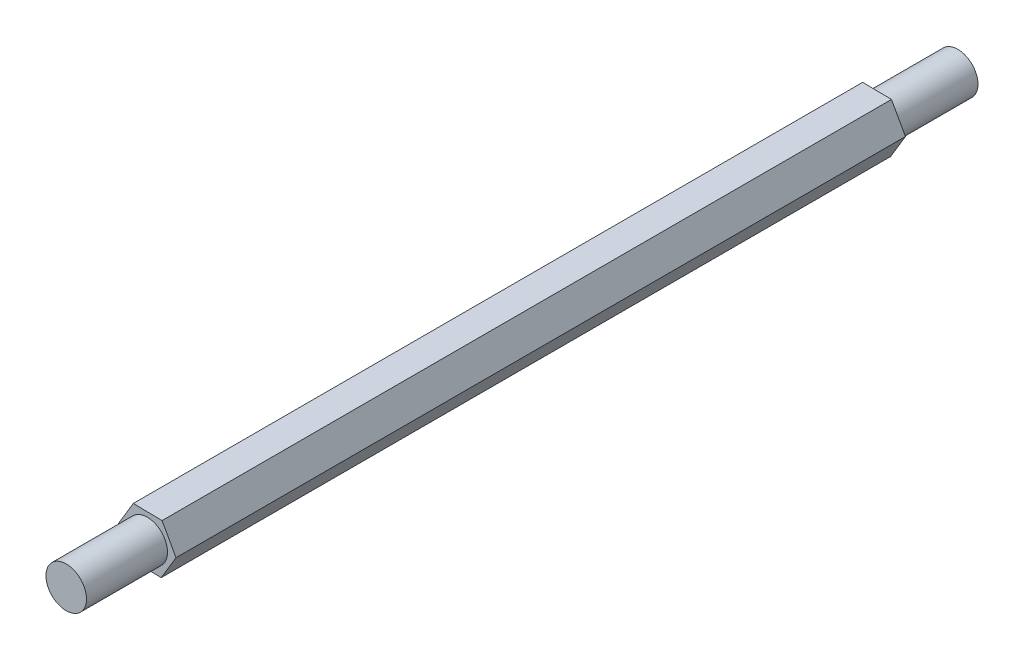
ISO-10303-21;
HEADER;
FILE_DESCRIPTION(('STEP AP214'),'2;1');
FILE_NAME('part.step','',(''),(''),'','','');
FILE_SCHEMA(('AUTOMOTIVE_DESIGN { 1 0 10303 214 1 1 1 1 }'));
ENDSEC;
DATA;
#1=APPLICATION_CONTEXT('core data for automotive mechanical design processes');
#2=APPLICATION_PROTOCOL_DEFINITION('international standard','automotive_design',2000,#1);
#3=PRODUCT_CONTEXT('',#1,'mechanical');
#4=PRODUCT('Part','Part','',(#3));
#5=PRODUCT_RELATED_PRODUCT_CATEGORY('part','',(#4));
#6=PRODUCT_DEFINITION_FORMATION('','',#4);
#7=PRODUCT_DEFINITION_CONTEXT('part definition',#1,'design');
#8=PRODUCT_DEFINITION('design','',#6,#7);
#9=PRODUCT_DEFINITION_SHAPE('','',#8);
#10=(LENGTH_UNIT() NAMED_UNIT(*) SI_UNIT(.MILLI.,.METRE.));
#11=(NAMED_UNIT(*) PLANE_ANGLE_UNIT() SI_UNIT($,.RADIAN.));
#12=(NAMED_UNIT(*) SI_UNIT($,.STERADIAN.) SOLID_ANGLE_UNIT());
#13=UNCERTAINTY_MEASURE_WITH_UNIT(LENGTH_MEASURE(1.E-05),#10,'distance_accuracy_value','');
#14=(GEOMETRIC_REPRESENTATION_CONTEXT(3) GLOBAL_UNCERTAINTY_ASSIGNED_CONTEXT((#13)) GLOBAL_UNIT_ASSIGNED_CONTEXT((#10,
#11,#12)) REPRESENTATION_CONTEXT('',''));
#15=CARTESIAN_POINT('',(0.,0.,0.));
#16=DIRECTION('',(0.,0.,1.));
#17=DIRECTION('',(1.,0.,0.));
#18=AXIS2_PLACEMENT_3D('',#15,#16,#17);
#19=CARTESIAN_POINT('',(0.,0.,10.));
#20=DIRECTION('',(0.,0.,-1.));
#21=DIRECTION('',(-1.,0.,0.));
#22=AXIS2_PLACEMENT_3D('',#19,#20,#21);
#23=CYLINDRICAL_SURFACE('',#22,2.5);
#24=CARTESIAN_POINT('',(0.,0.,10.));
#25=DIRECTION('',(0.,0.,1.));
#26=DIRECTION('',(1.,0.,0.));
#27=AXIS2_PLACEMENT_3D('',#24,#25,#26);
#28=CIRCLE('',#27,2.5);
#29=CARTESIAN_POINT('',(2.5,0.,10.));
#30=VERTEX_POINT('',#29);
#31=EDGE_CURVE('E55',#30,#30,#28,.T.);
#32=ORIENTED_EDGE('',*,*,#31,.F.);
#33=EDGE_LOOP('',(#32));
#34=FACE_BOUND('',#33,.T.);
#35=CARTESIAN_POINT('',(0.,0.,0.));
#36=DIRECTION('',(0.,0.,1.));
#37=DIRECTION('',(1.,0.,0.));
#38=AXIS2_PLACEMENT_3D('',#35,#36,#37);
#39=CIRCLE('',#38,2.5);
#40=CARTESIAN_POINT('',(2.5,0.,0.));
#41=VERTEX_POINT('',#40);
#42=EDGE_CURVE('E48',#41,#41,#39,.T.);
#43=ORIENTED_EDGE('',*,*,#42,.T.);
#44=EDGE_LOOP('',(#43));
#45=FACE_BOUND('',#44,.T.);
#46=ADVANCED_FACE('F45',(#34,#45),#23,.T.);
#47=CARTESIAN_POINT('',(0.,0.,0.));
#48=DIRECTION('',(0.,0.,1.));
#49=DIRECTION('',(1.,0.,0.));
#50=AXIS2_PLACEMENT_3D('',#47,#48,#49);
#51=PLANE('',#50);
#52=ORIENTED_EDGE('',*,*,#42,.F.);
#53=EDGE_LOOP('',(#52));
#54=FACE_BOUND('',#53,.T.);
#55=ADVANCED_FACE('F176',(#54),#51,.F.);
#56=CARTESIAN_POINT('',(1.72530609152991,-3.10214690047344,100.));
#57=DIRECTION('',(-0.857897146198672,0.513821453954751,0.));
#58=DIRECTION('',(-0.513821453954751,-0.857897146198672,0.));
#59=AXIS2_PLACEMENT_3D('',#56,#57,#58);
#60=PLANE('',#59);
#61=DIRECTION('',(0.513821453954751,0.857897146198672,0.));
#62=VECTOR('',#61,1.);
#63=CARTESIAN_POINT('',(1.72530609152991,-3.10214690047344,10.));
#64=LINE('',#63,#62);
#65=CARTESIAN_POINT('',(1.72530609152991,-3.10214690047344,10.));
#66=VERTEX_POINT('',#65);
#67=CARTESIAN_POINT('',(3.54919106784611,-0.0569145456677691,10.));
#68=VERTEX_POINT('',#67);
#69=EDGE_CURVE('E137',#66,#68,#64,.T.);
#70=ORIENTED_EDGE('',*,*,#69,.T.);
#71=DIRECTION('',(0.,0.,-1.));
#72=VECTOR('',#71,1.);
#73=CARTESIAN_POINT('',(3.54919106784611,-0.0569145456677691,100.));
#74=LINE('',#73,#72);
#75=CARTESIAN_POINT('',(3.54919106784611,-0.0569145456677691,100.));
#76=VERTEX_POINT('',#75);
#77=EDGE_CURVE('E165',#76,#68,#74,.T.);
#78=ORIENTED_EDGE('',*,*,#77,.F.);
#79=DIRECTION('',(0.513821453954751,0.857897146198672,0.));
#80=VECTOR('',#79,1.);
#81=CARTESIAN_POINT('',(1.72530609152991,-3.10214690047344,100.));
#82=LINE('',#81,#80);
#83=CARTESIAN_POINT('',(1.72530609152991,-3.10214690047344,100.));
#84=VERTEX_POINT('',#83);
#85=EDGE_CURVE('E154',#84,#76,#82,.T.);
#86=ORIENTED_EDGE('',*,*,#85,.F.);
#87=DIRECTION('',(0.,0.,-1.));
#88=VECTOR('',#87,1.);
#89=CARTESIAN_POINT('',(1.72530609152991,-3.10214690047344,100.));
#90=LINE('',#89,#88);
#91=EDGE_CURVE('E133',#84,#66,#90,.T.);
#92=ORIENTED_EDGE('',*,*,#91,.T.);
#93=EDGE_LOOP('',(#70,#78,#86,#92));
#94=FACE_BOUND('',#93,.T.);
#95=ADVANCED_FACE('F178',(#94),#60,.F.);
#96=CARTESIAN_POINT('',(3.54919106784611,-0.0569145456677691,100.));
#97=DIRECTION('',(-0.873931005233606,-0.486049995464848,0.));
#98=DIRECTION('',(0.486049995464848,-0.873931005233606,0.));
#99=AXIS2_PLACEMENT_3D('',#96,#97,#98);
#100=PLANE('',#99);
#101=DIRECTION('',(-0.486049995464848,0.873931005233606,0.));
#102=VECTOR('',#101,1.);
#103=CARTESIAN_POINT('',(3.54919106784611,-0.0569145456677691,10.));
#104=LINE('',#103,#102);
#105=CARTESIAN_POINT('',(1.82388497631619,3.04523235480567,10.));
#106=VERTEX_POINT('',#105);
#107=EDGE_CURVE('E141',#68,#106,#104,.T.);
#108=ORIENTED_EDGE('',*,*,#107,.T.);
#109=DIRECTION('',(0.,0.,-1.));
#110=VECTOR('',#109,1.);
#111=CARTESIAN_POINT('',(1.82388497631619,3.04523235480567,100.));
#112=LINE('',#111,#110);
#113=CARTESIAN_POINT('',(1.82388497631619,3.04523235480567,100.));
#114=VERTEX_POINT('',#113);
#115=EDGE_CURVE('E161',#114,#106,#112,.T.);
#116=ORIENTED_EDGE('',*,*,#115,.F.);
#117=DIRECTION('',(-0.486049995464848,0.873931005233606,0.));
#118=VECTOR('',#117,1.);
#119=CARTESIAN_POINT('',(3.54919106784611,-0.0569145456677691,100.));
#120=LINE('',#119,#118);
#121=EDGE_CURVE('E102',#76,#114,#120,.T.);
#122=ORIENTED_EDGE('',*,*,#121,.F.);
#123=ORIENTED_EDGE('',*,*,#77,.T.);
#124=EDGE_LOOP('',(#108,#116,#122,#123));
#125=FACE_BOUND('',#124,.T.);
#126=ADVANCED_FACE('F183',(#125),#100,.F.);
#127=CARTESIAN_POINT('',(1.82388497631619,3.04523235480567,100.));
#128=DIRECTION('',(-0.0160338590349338,-0.999871449419598,0.));
#129=DIRECTION('',(0.999871449419598,-0.0160338590349338,0.));
#130=AXIS2_PLACEMENT_3D('',#127,#128,#129);
#131=PLANE('',#130);
#132=DIRECTION('',(-0.999871449419598,0.0160338590349338,0.));
#133=VECTOR('',#132,1.);
#134=CARTESIAN_POINT('',(1.82388497631619,3.04523235480567,10.));
#135=LINE('',#134,#133);
#136=CARTESIAN_POINT('',(-1.72530609152992,3.10214690047344,10.));
#137=VERTEX_POINT('',#136);
#138=EDGE_CURVE('E145',#106,#137,#135,.T.);
#139=ORIENTED_EDGE('',*,*,#138,.T.);
#140=DIRECTION('',(0.,0.,-1.));
#141=VECTOR('',#140,1.);
#142=CARTESIAN_POINT('',(-1.72530609152992,3.10214690047344,100.));
#143=LINE('',#142,#141);
#144=CARTESIAN_POINT('',(-1.72530609152992,3.10214690047344,100.));
#145=VERTEX_POINT('',#144);
#146=EDGE_CURVE('E126',#145,#137,#143,.T.);
#147=ORIENTED_EDGE('',*,*,#146,.F.);
#148=DIRECTION('',(-0.999871449419598,0.0160338590349338,0.));
#149=VECTOR('',#148,1.);
#150=CARTESIAN_POINT('',(1.82388497631619,3.04523235480567,100.));
#151=LINE('',#150,#149);
#152=EDGE_CURVE('E115',#114,#145,#151,.T.);
#153=ORIENTED_EDGE('',*,*,#152,.F.);
#154=ORIENTED_EDGE('',*,*,#115,.T.);
#155=EDGE_LOOP('',(#139,#147,#153,#154));
#156=FACE_BOUND('',#155,.T.);
#157=ADVANCED_FACE('F190',(#156),#131,.F.);
#158=CARTESIAN_POINT('',(-1.72530609152992,3.10214690047344,100.));
#159=DIRECTION('',(0.857897146198673,-0.51382145395475,0.));
#160=DIRECTION('',(0.51382145395475,0.857897146198673,0.));
#161=AXIS2_PLACEMENT_3D('',#158,#159,#160);
#162=PLANE('',#161);
#163=DIRECTION('',(-0.51382145395475,-0.857897146198673,0.));
#164=VECTOR('',#163,1.);
#165=CARTESIAN_POINT('',(-1.72530609152992,3.10214690047344,10.));
#166=LINE('',#165,#164);
#167=CARTESIAN_POINT('',(-3.54919106784611,0.05691454566777,10.));
#168=VERTEX_POINT('',#167);
#169=EDGE_CURVE('E124',#137,#168,#166,.T.);
#170=ORIENTED_EDGE('',*,*,#169,.T.);
#171=DIRECTION('',(0.,0.,-1.));
#172=VECTOR('',#171,1.);
#173=CARTESIAN_POINT('',(-3.54919106784611,0.05691454566777,100.));
#174=LINE('',#173,#172);
#175=CARTESIAN_POINT('',(-3.54919106784611,0.05691454566777,100.));
#176=VERTEX_POINT('',#175);
#177=EDGE_CURVE('E121',#176,#168,#174,.T.);
#178=ORIENTED_EDGE('',*,*,#177,.F.);
#179=DIRECTION('',(-0.51382145395475,-0.857897146198673,0.));
#180=VECTOR('',#179,1.);
#181=CARTESIAN_POINT('',(-1.72530609152992,3.10214690047344,100.));
#182=LINE('',#181,#180);
#183=EDGE_CURVE('E109',#145,#176,#182,.T.);
#184=ORIENTED_EDGE('',*,*,#183,.F.);
#185=ORIENTED_EDGE('',*,*,#146,.T.);
#186=EDGE_LOOP('',(#170,#178,#184,#185));
#187=FACE_BOUND('',#186,.T.);
#188=ADVANCED_FACE('F122',(#187),#162,.F.);
#189=CARTESIAN_POINT('',(-3.54919106784611,0.05691454566777,100.));
#190=DIRECTION('',(0.873931005233607,0.486049995464847,0.));
#191=DIRECTION('',(-0.486049995464847,0.873931005233607,0.));
#192=AXIS2_PLACEMENT_3D('',#189,#190,#191);
#193=PLANE('',#192);
#194=DIRECTION('',(0.486049995464847,-0.873931005233607,0.));
#195=VECTOR('',#194,1.);
#196=CARTESIAN_POINT('',(-3.54919106784611,0.05691454566777,10.));
#197=LINE('',#196,#195);
#198=CARTESIAN_POINT('',(-1.82388497631619,-3.04523235480567,10.));
#199=VERTEX_POINT('',#198);
#200=EDGE_CURVE('E87',#168,#199,#197,.T.);
#201=ORIENTED_EDGE('',*,*,#200,.T.);
#202=DIRECTION('',(0.,0.,-1.));
#203=VECTOR('',#202,1.);
#204=CARTESIAN_POINT('',(-1.82388497631619,-3.04523235480567,100.));
#205=LINE('',#204,#203);
#206=CARTESIAN_POINT('',(-1.82388497631619,-3.04523235480567,100.));
#207=VERTEX_POINT('',#206);
#208=EDGE_CURVE('E127',#207,#199,#205,.T.);
#209=ORIENTED_EDGE('',*,*,#208,.F.);
#210=DIRECTION('',(0.486049995464847,-0.873931005233607,0.));
#211=VECTOR('',#210,1.);
#212=CARTESIAN_POINT('',(-3.54919106784611,0.05691454566777,100.));
#213=LINE('',#212,#211);
#214=EDGE_CURVE('E113',#176,#207,#213,.T.);
#215=ORIENTED_EDGE('',*,*,#214,.F.);
#216=ORIENTED_EDGE('',*,*,#177,.T.);
#217=EDGE_LOOP('',(#201,#209,#215,#216));
#218=FACE_BOUND('',#217,.T.);
#219=ADVANCED_FACE('F129',(#218),#193,.F.);
#220=CARTESIAN_POINT('',(-1.82388497631619,-3.04523235480567,100.));
#221=DIRECTION('',(0.0160338590349334,0.999871449419598,0.));
#222=DIRECTION('',(-0.999871449419598,0.0160338590349334,0.));
#223=AXIS2_PLACEMENT_3D('',#220,#221,#222);
#224=PLANE('',#223);
#225=DIRECTION('',(0.999871449419598,-0.0160338590349334,0.));
#226=VECTOR('',#225,1.);
#227=CARTESIAN_POINT('',(-1.82388497631619,-3.04523235480567,10.));
#228=LINE('',#227,#226);
#229=EDGE_CURVE('E93',#199,#66,#228,.T.);
#230=ORIENTED_EDGE('',*,*,#229,.T.);
#231=ORIENTED_EDGE('',*,*,#91,.F.);
#232=DIRECTION('',(0.999871449419598,-0.0160338590349334,0.));
#233=VECTOR('',#232,1.);
#234=CARTESIAN_POINT('',(-1.82388497631619,-3.04523235480567,100.));
#235=LINE('',#234,#233);
#236=EDGE_CURVE('E64',#207,#84,#235,.T.);
#237=ORIENTED_EDGE('',*,*,#236,.F.);
#238=ORIENTED_EDGE('',*,*,#208,.T.);
#239=EDGE_LOOP('',(#230,#231,#237,#238));
#240=FACE_BOUND('',#239,.T.);
#241=ADVANCED_FACE('F198',(#240),#224,.F.);
#242=CARTESIAN_POINT('',(0.,0.,100.));
#243=DIRECTION('',(0.,0.,1.));
#244=DIRECTION('',(1.,0.,0.));
#245=AXIS2_PLACEMENT_3D('',#242,#243,#244);
#246=PLANE('',#245);
#247=CARTESIAN_POINT('',(0.,0.,100.));
#248=DIRECTION('',(0.,0.,1.));
#249=DIRECTION('',(1.,0.,0.));
#250=AXIS2_PLACEMENT_3D('',#247,#248,#249);
#251=CIRCLE('',#250,2.5);
#252=CARTESIAN_POINT('',(2.5,0.,100.));
#253=VERTEX_POINT('',#252);
#254=EDGE_CURVE('E11',#253,#253,#251,.T.);
#255=ORIENTED_EDGE('',*,*,#254,.F.);
#256=EDGE_LOOP('',(#255));
#257=FACE_BOUND('',#256,.T.);
#258=ORIENTED_EDGE('',*,*,#85,.T.);
#259=ORIENTED_EDGE('',*,*,#121,.T.);
#260=ORIENTED_EDGE('',*,*,#152,.T.);
#261=ORIENTED_EDGE('',*,*,#183,.T.);
#262=ORIENTED_EDGE('',*,*,#214,.T.);
#263=ORIENTED_EDGE('',*,*,#236,.T.);
#264=EDGE_LOOP('',(#258,#259,#260,#261,#262,#263));
#265=FACE_BOUND('',#264,.T.);
#266=ADVANCED_FACE('F111',(#257,#265),#246,.T.);
#267=CARTESIAN_POINT('',(0.,0.,10.));
#268=DIRECTION('',(0.,0.,1.));
#269=DIRECTION('',(1.,0.,0.));
#270=AXIS2_PLACEMENT_3D('',#267,#268,#269);
#271=PLANE('',#270);
#272=ORIENTED_EDGE('',*,*,#31,.T.);
#273=EDGE_LOOP('',(#272));
#274=FACE_BOUND('',#273,.T.);
#275=ORIENTED_EDGE('',*,*,#69,.F.);
#276=ORIENTED_EDGE('',*,*,#229,.F.);
#277=ORIENTED_EDGE('',*,*,#200,.F.);
#278=ORIENTED_EDGE('',*,*,#169,.F.);
#279=ORIENTED_EDGE('',*,*,#138,.F.);
#280=ORIENTED_EDGE('',*,*,#107,.F.);
#281=EDGE_LOOP('',(#275,#276,#277,#278,#279,#280));
#282=FACE_BOUND('',#281,.T.);
#283=ADVANCED_FACE('F201',(#274,#282),#271,.F.);
#284=CARTESIAN_POINT('',(0.,0.,110.));
#285=DIRECTION('',(0.,0.,-1.));
#286=DIRECTION('',(-1.,0.,0.));
#287=AXIS2_PLACEMENT_3D('',#284,#285,#286);
#288=CYLINDRICAL_SURFACE('',#287,2.5);
#289=CARTESIAN_POINT('',(0.,0.,110.));
#290=DIRECTION('',(0.,0.,1.));
#291=DIRECTION('',(1.,0.,0.));
#292=AXIS2_PLACEMENT_3D('',#289,#290,#291);
#293=CIRCLE('',#292,2.5);
#294=CARTESIAN_POINT('',(2.5,0.,110.));
#295=VERTEX_POINT('',#294);
#296=EDGE_CURVE('E142',#295,#295,#293,.T.);
#297=ORIENTED_EDGE('',*,*,#296,.F.);
#298=EDGE_LOOP('',(#297));
#299=FACE_BOUND('',#298,.T.);
#300=ORIENTED_EDGE('',*,*,#254,.T.);
#301=EDGE_LOOP('',(#300));
#302=FACE_BOUND('',#301,.T.);
#303=ADVANCED_FACE('F204',(#299,#302),#288,.T.);
#304=CARTESIAN_POINT('',(0.,0.,110.));
#305=DIRECTION('',(0.,0.,1.));
#306=DIRECTION('',(1.,0.,0.));
#307=AXIS2_PLACEMENT_3D('',#304,#305,#306);
#308=PLANE('',#307);
#309=ORIENTED_EDGE('',*,*,#296,.T.);
#310=EDGE_LOOP('',(#309));
#311=FACE_BOUND('',#310,.T.);
#312=ADVANCED_FACE('F210',(#311),#308,.T.);
#313=CLOSED_SHELL('',(#46,#55,#95,#126,#157,#188,#219,#241,#266,#283,#303,#312));
#314=MANIFOLD_SOLID_BREP('B2',#313);
#315=ADVANCED_BREP_SHAPE_REPRESENTATION('',(#18,#314),#14);
#316=SHAPE_DEFINITION_REPRESENTATION(#9,#315);
ENDSEC;
END-ISO-10303-21;
